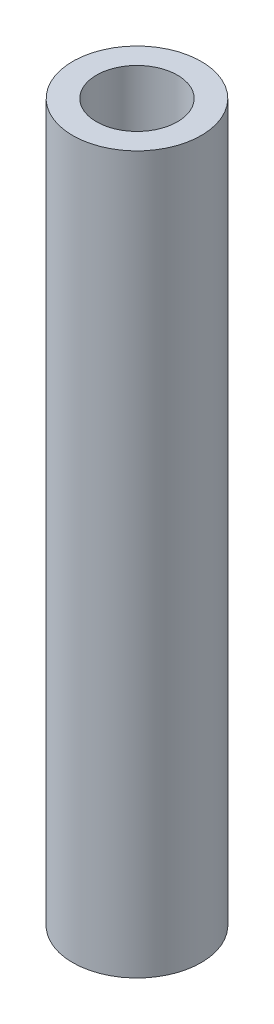
ISO-10303-21;
HEADER;
FILE_DESCRIPTION(('STEP AP214'),'2;1');
FILE_NAME('part.step','',(''),(''),'','','');
FILE_SCHEMA(('AUTOMOTIVE_DESIGN { 1 0 10303 214 1 1 1 1 }'));
ENDSEC;
DATA;
#1=APPLICATION_CONTEXT('core data for automotive mechanical design processes');
#2=APPLICATION_PROTOCOL_DEFINITION('international standard','automotive_design',2000,#1);
#3=PRODUCT_CONTEXT('',#1,'mechanical');
#4=PRODUCT('Part','Part','',(#3));
#5=PRODUCT_RELATED_PRODUCT_CATEGORY('part','',(#4));
#6=PRODUCT_DEFINITION_FORMATION('','',#4);
#7=PRODUCT_DEFINITION_CONTEXT('part definition',#1,'design');
#8=PRODUCT_DEFINITION('design','',#6,#7);
#9=PRODUCT_DEFINITION_SHAPE('','',#8);
#10=(LENGTH_UNIT() NAMED_UNIT(*) SI_UNIT(.MILLI.,.METRE.));
#11=(NAMED_UNIT(*) PLANE_ANGLE_UNIT() SI_UNIT($,.RADIAN.));
#12=(NAMED_UNIT(*) SI_UNIT($,.STERADIAN.) SOLID_ANGLE_UNIT());
#13=UNCERTAINTY_MEASURE_WITH_UNIT(LENGTH_MEASURE(1.E-05),#10,'distance_accuracy_value','');
#14=(GEOMETRIC_REPRESENTATION_CONTEXT(3) GLOBAL_UNCERTAINTY_ASSIGNED_CONTEXT((#13)) GLOBAL_UNIT_ASSIGNED_CONTEXT((#10,
#11,#12)) REPRESENTATION_CONTEXT('',''));
#15=CARTESIAN_POINT('',(0.,0.,0.));
#16=DIRECTION('',(0.,0.,1.));
#17=DIRECTION('',(1.,0.,0.));
#18=AXIS2_PLACEMENT_3D('',#15,#16,#17);
#19=CARTESIAN_POINT('',(0.,17.7,0.));
#20=DIRECTION('',(0.,-1.,0.));
#21=DIRECTION('',(0.,0.,-1.));
#22=AXIS2_PLACEMENT_3D('',#19,#20,#21);
#23=CYLINDRICAL_SURFACE('',#22,2.);
#24=CARTESIAN_POINT('',(0.,17.7,0.));
#25=DIRECTION('',(0.,1.,0.));
#26=DIRECTION('',(0.,0.,1.));
#27=AXIS2_PLACEMENT_3D('',#24,#25,#26);
#28=CIRCLE('',#27,2.);
#29=CARTESIAN_POINT('',(0.,17.7,2.));
#30=VERTEX_POINT('',#29);
#31=EDGE_CURVE('E44',#30,#30,#28,.T.);
#32=ORIENTED_EDGE('',*,*,#31,.T.);
#33=EDGE_LOOP('',(#32));
#34=FACE_BOUND('',#33,.T.);
#35=CARTESIAN_POINT('',(0.,-17.7,0.));
#36=DIRECTION('',(0.,1.,0.));
#37=DIRECTION('',(0.,0.,1.));
#38=AXIS2_PLACEMENT_3D('',#35,#36,#37);
#39=CIRCLE('',#38,2.);
#40=CARTESIAN_POINT('',(0.,-17.7,2.));
#41=VERTEX_POINT('',#40);
#42=EDGE_CURVE('E50',#41,#41,#39,.T.);
#43=ORIENTED_EDGE('',*,*,#42,.F.);
#44=EDGE_LOOP('',(#43));
#45=FACE_BOUND('',#44,.T.);
#46=ADVANCED_FACE('F37',(#34,#45),#23,.F.);
#47=CARTESIAN_POINT('',(0.,17.7,0.));
#48=DIRECTION('',(0.,-1.,0.));
#49=DIRECTION('',(0.,0.,-1.));
#50=AXIS2_PLACEMENT_3D('',#47,#48,#49);
#51=CYLINDRICAL_SURFACE('',#50,3.175);
#52=CARTESIAN_POINT('',(0.,17.7,0.));
#53=DIRECTION('',(0.,1.,0.));
#54=DIRECTION('',(0.,0.,1.));
#55=AXIS2_PLACEMENT_3D('',#52,#53,#54);
#56=CIRCLE('',#55,3.175);
#57=CARTESIAN_POINT('',(0.,17.7,3.175));
#58=VERTEX_POINT('',#57);
#59=EDGE_CURVE('E10',#58,#58,#56,.T.);
#60=ORIENTED_EDGE('',*,*,#59,.F.);
#61=EDGE_LOOP('',(#60));
#62=FACE_BOUND('',#61,.T.);
#63=CARTESIAN_POINT('',(0.,-17.7,0.));
#64=DIRECTION('',(0.,1.,0.));
#65=DIRECTION('',(0.,0.,1.));
#66=AXIS2_PLACEMENT_3D('',#63,#64,#65);
#67=CIRCLE('',#66,3.175);
#68=CARTESIAN_POINT('',(0.,-17.7,3.175));
#69=VERTEX_POINT('',#68);
#70=EDGE_CURVE('E40',#69,#69,#67,.T.);
#71=ORIENTED_EDGE('',*,*,#70,.T.);
#72=EDGE_LOOP('',(#71));
#73=FACE_BOUND('',#72,.T.);
#74=ADVANCED_FACE('F57',(#62,#73),#51,.T.);
#75=CARTESIAN_POINT('',(0.,17.7,0.));
#76=DIRECTION('',(0.,1.,0.));
#77=DIRECTION('',(0.,0.,1.));
#78=AXIS2_PLACEMENT_3D('',#75,#76,#77);
#79=PLANE('',#78);
#80=ORIENTED_EDGE('',*,*,#31,.F.);
#81=EDGE_LOOP('',(#80));
#82=FACE_BOUND('',#81,.T.);
#83=ORIENTED_EDGE('',*,*,#59,.T.);
#84=EDGE_LOOP('',(#83));
#85=FACE_BOUND('',#84,.T.);
#86=ADVANCED_FACE('F61',(#82,#85),#79,.T.);
#87=CARTESIAN_POINT('',(0.,-17.7,0.));
#88=DIRECTION('',(0.,1.,0.));
#89=DIRECTION('',(0.,0.,1.));
#90=AXIS2_PLACEMENT_3D('',#87,#88,#89);
#91=PLANE('',#90);
#92=ORIENTED_EDGE('',*,*,#42,.T.);
#93=EDGE_LOOP('',(#92));
#94=FACE_BOUND('',#93,.T.);
#95=ORIENTED_EDGE('',*,*,#70,.F.);
#96=EDGE_LOOP('',(#95));
#97=FACE_BOUND('',#96,.T.);
#98=ADVANCED_FACE('F59',(#94,#97),#91,.F.);
#99=CLOSED_SHELL('',(#46,#74,#86,#98));
#100=MANIFOLD_SOLID_BREP('B2',#99);
#101=ADVANCED_BREP_SHAPE_REPRESENTATION('',(#18,#100),#14);
#102=SHAPE_DEFINITION_REPRESENTATION(#9,#101);
ENDSEC;
END-ISO-10303-21;
